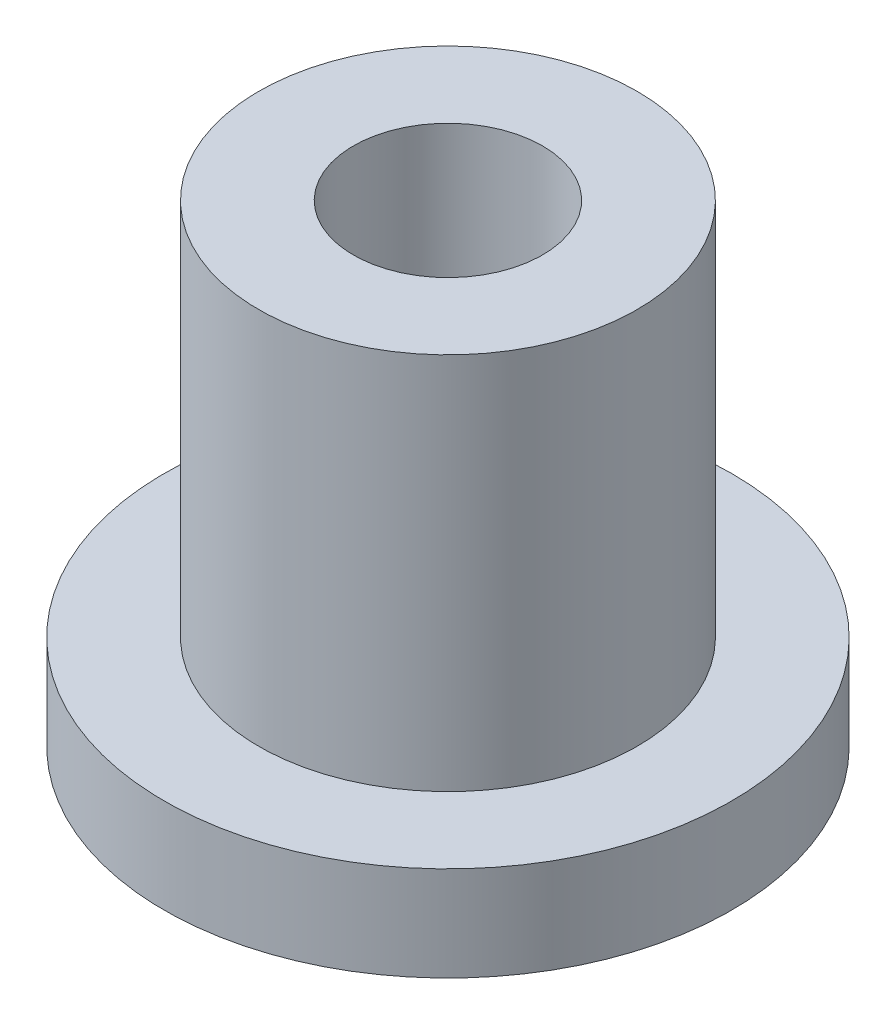
ISO-10303-21;
HEADER;
FILE_DESCRIPTION(('STEP AP214'),'2;1');
FILE_NAME('part.step','',(''),(''),'','','');
FILE_SCHEMA(('AUTOMOTIVE_DESIGN { 1 0 10303 214 1 1 1 1 }'));
ENDSEC;
DATA;
#1=APPLICATION_CONTEXT('core data for automotive mechanical design processes');
#2=APPLICATION_PROTOCOL_DEFINITION('international standard','automotive_design',2000,#1);
#3=PRODUCT_CONTEXT('',#1,'mechanical');
#4=PRODUCT('Part','Part','',(#3));
#5=PRODUCT_RELATED_PRODUCT_CATEGORY('part','',(#4));
#6=PRODUCT_DEFINITION_FORMATION('','',#4);
#7=PRODUCT_DEFINITION_CONTEXT('part definition',#1,'design');
#8=PRODUCT_DEFINITION('design','',#6,#7);
#9=PRODUCT_DEFINITION_SHAPE('','',#8);
#10=(LENGTH_UNIT() NAMED_UNIT(*) SI_UNIT(.MILLI.,.METRE.));
#11=(NAMED_UNIT(*) PLANE_ANGLE_UNIT() SI_UNIT($,.RADIAN.));
#12=(NAMED_UNIT(*) SI_UNIT($,.STERADIAN.) SOLID_ANGLE_UNIT());
#13=UNCERTAINTY_MEASURE_WITH_UNIT(LENGTH_MEASURE(1.E-05),#10,'distance_accuracy_value','');
#14=(GEOMETRIC_REPRESENTATION_CONTEXT(3) GLOBAL_UNCERTAINTY_ASSIGNED_CONTEXT((#13)) GLOBAL_UNIT_ASSIGNED_CONTEXT((#10,
#11,#12)) REPRESENTATION_CONTEXT('',''));
#15=CARTESIAN_POINT('',(0.,0.,0.));
#16=DIRECTION('',(0.,0.,1.));
#17=DIRECTION('',(1.,0.,0.));
#18=AXIS2_PLACEMENT_3D('',#15,#16,#17);
#19=CARTESIAN_POINT('',(-4.,10.,0.));
#20=DIRECTION('',(0.,-1.,0.));
#21=DIRECTION('',(0.,0.,-1.));
#22=AXIS2_PLACEMENT_3D('',#19,#20,#21);
#23=PLANE('',#22);
#24=CARTESIAN_POINT('',(0.,10.,0.));
#25=DIRECTION('',(0.,-1.,0.));
#26=DIRECTION('',(0.,0.,-1.));
#27=AXIS2_PLACEMENT_3D('',#24,#25,#26);
#28=CIRCLE('',#27,4.);
#29=CARTESIAN_POINT('',(0.,10.,-4.));
#30=VERTEX_POINT('',#29);
#31=EDGE_CURVE('E54',#30,#30,#28,.T.);
#32=ORIENTED_EDGE('',*,*,#31,.F.);
#33=EDGE_LOOP('',(#32));
#34=FACE_BOUND('',#33,.T.);
#35=CARTESIAN_POINT('',(0.,10.,0.));
#36=DIRECTION('',(0.,-1.,0.));
#37=DIRECTION('',(0.,0.,-1.));
#38=AXIS2_PLACEMENT_3D('',#35,#36,#37);
#39=CIRCLE('',#38,2.);
#40=CARTESIAN_POINT('',(0.,10.,-2.));
#41=VERTEX_POINT('',#40);
#42=EDGE_CURVE('E10',#41,#41,#39,.T.);
#43=ORIENTED_EDGE('',*,*,#42,.T.);
#44=EDGE_LOOP('',(#43));
#45=FACE_BOUND('',#44,.T.);
#46=ADVANCED_FACE('F32',(#34,#45),#23,.F.);
#47=CARTESIAN_POINT('',(0.,0.,0.));
#48=DIRECTION('',(0.,-1.,0.));
#49=DIRECTION('',(0.,0.,-1.));
#50=AXIS2_PLACEMENT_3D('',#47,#48,#49);
#51=CYLINDRICAL_SURFACE('',#50,2.);
#52=ORIENTED_EDGE('',*,*,#42,.F.);
#53=EDGE_LOOP('',(#52));
#54=FACE_BOUND('',#53,.T.);
#55=CARTESIAN_POINT('',(0.,0.,0.));
#56=DIRECTION('',(0.,-1.,0.));
#57=DIRECTION('',(0.,0.,-1.));
#58=AXIS2_PLACEMENT_3D('',#55,#56,#57);
#59=CIRCLE('',#58,2.);
#60=CARTESIAN_POINT('',(0.,0.,-2.));
#61=VERTEX_POINT('',#60);
#62=EDGE_CURVE('E38',#61,#61,#59,.T.);
#63=ORIENTED_EDGE('',*,*,#62,.T.);
#64=EDGE_LOOP('',(#63));
#65=FACE_BOUND('',#64,.T.);
#66=ADVANCED_FACE('F61',(#54,#65),#51,.F.);
#67=CARTESIAN_POINT('',(-2.,0.,0.));
#68=DIRECTION('',(0.,1.,0.));
#69=DIRECTION('',(0.,0.,1.));
#70=AXIS2_PLACEMENT_3D('',#67,#68,#69);
#71=PLANE('',#70);
#72=ORIENTED_EDGE('',*,*,#62,.F.);
#73=EDGE_LOOP('',(#72));
#74=FACE_BOUND('',#73,.T.);
#75=CARTESIAN_POINT('',(0.,0.,0.));
#76=DIRECTION('',(0.,-1.,0.));
#77=DIRECTION('',(0.,0.,-1.));
#78=AXIS2_PLACEMENT_3D('',#75,#76,#77);
#79=CIRCLE('',#78,6.);
#80=CARTESIAN_POINT('',(0.,0.,-6.));
#81=VERTEX_POINT('',#80);
#82=EDGE_CURVE('E42',#81,#81,#79,.T.);
#83=ORIENTED_EDGE('',*,*,#82,.T.);
#84=EDGE_LOOP('',(#83));
#85=FACE_BOUND('',#84,.T.);
#86=ADVANCED_FACE('F65',(#74,#85),#71,.F.);
#87=CARTESIAN_POINT('',(0.,0.,0.));
#88=DIRECTION('',(0.,-1.,0.));
#89=DIRECTION('',(0.,0.,-1.));
#90=AXIS2_PLACEMENT_3D('',#87,#88,#89);
#91=CYLINDRICAL_SURFACE('',#90,6.);
#92=ORIENTED_EDGE('',*,*,#82,.F.);
#93=EDGE_LOOP('',(#92));
#94=FACE_BOUND('',#93,.T.);
#95=CARTESIAN_POINT('',(0.,2.,0.));
#96=DIRECTION('',(0.,-1.,0.));
#97=DIRECTION('',(0.,0.,-1.));
#98=AXIS2_PLACEMENT_3D('',#95,#96,#97);
#99=CIRCLE('',#98,6.);
#100=CARTESIAN_POINT('',(0.,2.,-6.));
#101=VERTEX_POINT('',#100);
#102=EDGE_CURVE('E46',#101,#101,#99,.T.);
#103=ORIENTED_EDGE('',*,*,#102,.T.);
#104=EDGE_LOOP('',(#103));
#105=FACE_BOUND('',#104,.T.);
#106=ADVANCED_FACE('F70',(#94,#105),#91,.T.);
#107=CARTESIAN_POINT('',(-6.,2.,0.));
#108=DIRECTION('',(0.,-1.,0.));
#109=DIRECTION('',(0.,0.,-1.));
#110=AXIS2_PLACEMENT_3D('',#107,#108,#109);
#111=PLANE('',#110);
#112=ORIENTED_EDGE('',*,*,#102,.F.);
#113=EDGE_LOOP('',(#112));
#114=FACE_BOUND('',#113,.T.);
#115=CARTESIAN_POINT('',(0.,1.99999999999999,0.));
#116=DIRECTION('',(0.,-1.,0.));
#117=DIRECTION('',(0.,0.,-1.));
#118=AXIS2_PLACEMENT_3D('',#115,#116,#117);
#119=CIRCLE('',#118,4.);
#120=CARTESIAN_POINT('',(0.,1.99999999999999,-4.));
#121=VERTEX_POINT('',#120);
#122=EDGE_CURVE('E51',#121,#121,#119,.T.);
#123=ORIENTED_EDGE('',*,*,#122,.T.);
#124=EDGE_LOOP('',(#123));
#125=FACE_BOUND('',#124,.T.);
#126=ADVANCED_FACE('F76',(#114,#125),#111,.F.);
#127=CARTESIAN_POINT('',(0.,0.,0.));
#128=DIRECTION('',(0.,-1.,0.));
#129=DIRECTION('',(0.,0.,-1.));
#130=AXIS2_PLACEMENT_3D('',#127,#128,#129);
#131=CYLINDRICAL_SURFACE('',#130,4.);
#132=ORIENTED_EDGE('',*,*,#122,.F.);
#133=EDGE_LOOP('',(#132));
#134=FACE_BOUND('',#133,.T.);
#135=ORIENTED_EDGE('',*,*,#31,.T.);
#136=EDGE_LOOP('',(#135));
#137=FACE_BOUND('',#136,.T.);
#138=ADVANCED_FACE('F58',(#134,#137),#131,.T.);
#139=CLOSED_SHELL('',(#46,#66,#86,#106,#126,#138));
#140=MANIFOLD_SOLID_BREP('B2',#139);
#141=ADVANCED_BREP_SHAPE_REPRESENTATION('',(#18,#140),#14);
#142=SHAPE_DEFINITION_REPRESENTATION(#9,#141);
ENDSEC;
END-ISO-10303-21;
